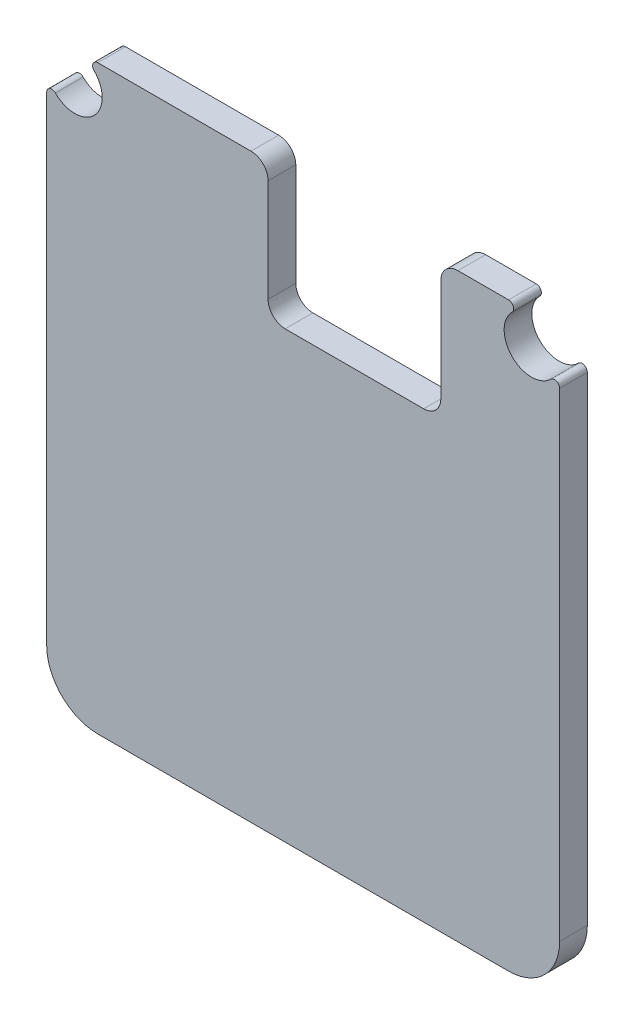
ISO-10303-21;
HEADER;
FILE_DESCRIPTION(('STEP AP214'),'2;1');
FILE_NAME('part.step','',(''),(''),'','','');
FILE_SCHEMA(('AUTOMOTIVE_DESIGN { 1 0 10303 214 1 1 1 1 }'));
ENDSEC;
DATA;
#1=APPLICATION_CONTEXT('core data for automotive mechanical design processes');
#2=APPLICATION_PROTOCOL_DEFINITION('international standard','automotive_design',2000,#1);
#3=PRODUCT_CONTEXT('',#1,'mechanical');
#4=PRODUCT('Part','Part','',(#3));
#5=PRODUCT_RELATED_PRODUCT_CATEGORY('part','',(#4));
#6=PRODUCT_DEFINITION_FORMATION('','',#4);
#7=PRODUCT_DEFINITION_CONTEXT('part definition',#1,'design');
#8=PRODUCT_DEFINITION('design','',#6,#7);
#9=PRODUCT_DEFINITION_SHAPE('','',#8);
#10=(LENGTH_UNIT() NAMED_UNIT(*) SI_UNIT(.MILLI.,.METRE.));
#11=(NAMED_UNIT(*) PLANE_ANGLE_UNIT() SI_UNIT($,.RADIAN.));
#12=(NAMED_UNIT(*) SI_UNIT($,.STERADIAN.) SOLID_ANGLE_UNIT());
#13=UNCERTAINTY_MEASURE_WITH_UNIT(LENGTH_MEASURE(1.E-05),#10,'distance_accuracy_value','');
#14=(GEOMETRIC_REPRESENTATION_CONTEXT(3) GLOBAL_UNCERTAINTY_ASSIGNED_CONTEXT((#13)) GLOBAL_UNIT_ASSIGNED_CONTEXT((#10,
#11,#12)) REPRESENTATION_CONTEXT('',''));
#15=CARTESIAN_POINT('',(0.,0.,0.));
#16=DIRECTION('',(0.,0.,1.));
#17=DIRECTION('',(1.,0.,0.));
#18=AXIS2_PLACEMENT_3D('',#15,#16,#17);
#19=CARTESIAN_POINT('',(13.,29.,1.6194));
#20=DIRECTION('',(0.,0.,-1.));
#21=DIRECTION('',(-1.,0.,0.));
#22=AXIS2_PLACEMENT_3D('',#19,#20,#21);
#23=CYLINDRICAL_SURFACE('',#22,3.);
#24=CARTESIAN_POINT('',(13.,29.,0.));
#25=DIRECTION('',(0.,0.,1.));
#26=DIRECTION('',(-1.,0.,0.));
#27=AXIS2_PLACEMENT_3D('',#24,#25,#26);
#28=CIRCLE('',#27,3.);
#29=CARTESIAN_POINT('',(10.,29.,0.));
#30=VERTEX_POINT('',#29);
#31=CARTESIAN_POINT('',(13.,26.,0.));
#32=VERTEX_POINT('',#31);
#33=EDGE_CURVE('E203',#30,#32,#28,.T.);
#34=ORIENTED_EDGE('',*,*,#33,.T.);
#35=DIRECTION('',(0.,0.,-1.));
#36=VECTOR('',#35,1.);
#37=CARTESIAN_POINT('',(13.,26.,1.6194));
#38=LINE('',#37,#36);
#39=CARTESIAN_POINT('',(13.,26.,1.6194));
#40=VERTEX_POINT('',#39);
#41=EDGE_CURVE('E11',#40,#32,#38,.T.);
#42=ORIENTED_EDGE('',*,*,#41,.F.);
#43=CARTESIAN_POINT('',(13.,29.,1.6194));
#44=DIRECTION('',(0.,0.,1.));
#45=DIRECTION('',(-1.,0.,0.));
#46=AXIS2_PLACEMENT_3D('',#43,#44,#45);
#47=CIRCLE('',#46,3.);
#48=CARTESIAN_POINT('',(10.,29.,1.6194));
#49=VERTEX_POINT('',#48);
#50=EDGE_CURVE('E241',#49,#40,#47,.T.);
#51=ORIENTED_EDGE('',*,*,#50,.F.);
#52=DIRECTION('',(0.,0.,-1.));
#53=VECTOR('',#52,1.);
#54=CARTESIAN_POINT('',(10.,29.,1.6194));
#55=LINE('',#54,#53);
#56=EDGE_CURVE('E199',#49,#30,#55,.T.);
#57=ORIENTED_EDGE('',*,*,#56,.T.);
#58=EDGE_LOOP('',(#34,#42,#51,#57));
#59=FACE_BOUND('',#58,.T.);
#60=ADVANCED_FACE('F35',(#59),#23,.T.);
#61=CARTESIAN_POINT('',(37.,26.,1.6194));
#62=DIRECTION('',(0.,1.,0.));
#63=DIRECTION('',(0.,0.,1.));
#64=AXIS2_PLACEMENT_3D('',#61,#62,#63);
#65=PLANE('',#64);
#66=DIRECTION('',(1.,0.,0.));
#67=VECTOR('',#66,1.);
#68=CARTESIAN_POINT('',(37.,26.,0.));
#69=LINE('',#68,#67);
#70=CARTESIAN_POINT('',(37.,26.,0.));
#71=VERTEX_POINT('',#70);
#72=EDGE_CURVE('E206',#32,#71,#69,.T.);
#73=ORIENTED_EDGE('',*,*,#72,.T.);
#74=DIRECTION('',(0.,0.,-1.));
#75=VECTOR('',#74,1.);
#76=CARTESIAN_POINT('',(37.,26.,1.6194));
#77=LINE('',#76,#75);
#78=CARTESIAN_POINT('',(37.,26.,1.6194));
#79=VERTEX_POINT('',#78);
#80=EDGE_CURVE('E43',#79,#71,#77,.T.);
#81=ORIENTED_EDGE('',*,*,#80,.F.);
#82=DIRECTION('',(1.,0.,0.));
#83=VECTOR('',#82,1.);
#84=CARTESIAN_POINT('',(37.,26.,1.6194));
#85=LINE('',#84,#83);
#86=EDGE_CURVE('E130',#40,#79,#85,.T.);
#87=ORIENTED_EDGE('',*,*,#86,.F.);
#88=ORIENTED_EDGE('',*,*,#41,.T.);
#89=EDGE_LOOP('',(#73,#81,#87,#88));
#90=FACE_BOUND('',#89,.T.);
#91=ADVANCED_FACE('F359',(#90),#65,.F.);
#92=CARTESIAN_POINT('',(37.0000100000167,28.9999899999833,1.6194));
#93=DIRECTION('',(0.,0.,-1.));
#94=DIRECTION('',(-1.,0.,0.));
#95=AXIS2_PLACEMENT_3D('',#92,#93,#94);
#96=CYLINDRICAL_SURFACE('',#95,2.99999);
#97=CARTESIAN_POINT('',(37.0000100000167,28.9999899999833,0.));
#98=DIRECTION('',(0.,0.,1.));
#99=DIRECTION('',(-1.,0.,0.));
#100=AXIS2_PLACEMENT_3D('',#97,#98,#99);
#101=CIRCLE('',#100,2.99999);
#102=CARTESIAN_POINT('',(40.,29.,0.));
#103=VERTEX_POINT('',#102);
#104=EDGE_CURVE('E208',#71,#103,#101,.T.);
#105=ORIENTED_EDGE('',*,*,#104,.T.);
#106=DIRECTION('',(0.,0.,-1.));
#107=VECTOR('',#106,1.);
#108=CARTESIAN_POINT('',(40.,29.,1.6194));
#109=LINE('',#108,#107);
#110=CARTESIAN_POINT('',(40.,29.,1.6194));
#111=VERTEX_POINT('',#110);
#112=EDGE_CURVE('E284',#111,#103,#109,.T.);
#113=ORIENTED_EDGE('',*,*,#112,.F.);
#114=CARTESIAN_POINT('',(37.0000100000167,28.9999899999833,1.6194));
#115=DIRECTION('',(0.,0.,1.));
#116=DIRECTION('',(-1.,0.,0.));
#117=AXIS2_PLACEMENT_3D('',#114,#115,#116);
#118=CIRCLE('',#117,2.99999);
#119=EDGE_CURVE('E292',#79,#111,#118,.T.);
#120=ORIENTED_EDGE('',*,*,#119,.F.);
#121=ORIENTED_EDGE('',*,*,#80,.T.);
#122=EDGE_LOOP('',(#105,#113,#120,#121));
#123=FACE_BOUND('',#122,.T.);
#124=ADVANCED_FACE('F290',(#123),#96,.T.);
#125=CARTESIAN_POINT('',(40.,57.01299,1.6194));
#126=DIRECTION('',(-1.,0.,0.));
#127=DIRECTION('',(0.,0.,1.));
#128=AXIS2_PLACEMENT_3D('',#125,#126,#127);
#129=PLANE('',#128);
#130=DIRECTION('',(0.,1.,0.));
#131=VECTOR('',#130,1.);
#132=CARTESIAN_POINT('',(40.,57.01299,0.));
#133=LINE('',#132,#131);
#134=CARTESIAN_POINT('',(40.,57.01299,0.));
#135=VERTEX_POINT('',#134);
#136=EDGE_CURVE('E210',#103,#135,#133,.T.);
#137=ORIENTED_EDGE('',*,*,#136,.T.);
#138=DIRECTION('',(0.,0.,-1.));
#139=VECTOR('',#138,1.);
#140=CARTESIAN_POINT('',(40.,57.01299,1.6194));
#141=LINE('',#140,#139);
#142=CARTESIAN_POINT('',(40.,57.01299,1.6194));
#143=VERTEX_POINT('',#142);
#144=EDGE_CURVE('E281',#143,#135,#141,.T.);
#145=ORIENTED_EDGE('',*,*,#144,.F.);
#146=DIRECTION('',(0.,1.,0.));
#147=VECTOR('',#146,1.);
#148=CARTESIAN_POINT('',(40.,57.01299,1.6194));
#149=LINE('',#148,#147);
#150=EDGE_CURVE('E310',#111,#143,#149,.T.);
#151=ORIENTED_EDGE('',*,*,#150,.F.);
#152=ORIENTED_EDGE('',*,*,#112,.T.);
#153=EDGE_LOOP('',(#137,#145,#151,#152));
#154=FACE_BOUND('',#153,.T.);
#155=ADVANCED_FACE('F301',(#154),#129,.F.);
#156=CARTESIAN_POINT('',(39.700000000423,57.0130059320103,1.6194));
#157=DIRECTION('',(0.,0.,-1.));
#158=DIRECTION('',(-1.,0.,0.));
#159=AXIS2_PLACEMENT_3D('',#156,#157,#158);
#160=CYLINDRICAL_SURFACE('',#159,0.300000000000002);
#161=CARTESIAN_POINT('',(39.700000000423,57.0130059320103,0.));
#162=DIRECTION('',(0.,0.,1.));
#163=DIRECTION('',(-1.,0.,0.));
#164=AXIS2_PLACEMENT_3D('',#161,#162,#163);
#165=CIRCLE('',#164,0.300000000000002);
#166=CARTESIAN_POINT('',(39.48786,57.22513,0.));
#167=VERTEX_POINT('',#166);
#168=EDGE_CURVE('E212',#135,#167,#165,.T.);
#169=ORIENTED_EDGE('',*,*,#168,.T.);
#170=DIRECTION('',(0.,0.,-1.));
#171=VECTOR('',#170,1.);
#172=CARTESIAN_POINT('',(39.48786,57.22513,1.6194));
#173=LINE('',#172,#171);
#174=CARTESIAN_POINT('',(39.48786,57.22513,1.6194));
#175=VERTEX_POINT('',#174);
#176=EDGE_CURVE('E278',#175,#167,#173,.T.);
#177=ORIENTED_EDGE('',*,*,#176,.F.);
#178=CARTESIAN_POINT('',(39.700000000423,57.0130059320103,1.6194));
#179=DIRECTION('',(0.,0.,1.));
#180=DIRECTION('',(-1.,0.,0.));
#181=AXIS2_PLACEMENT_3D('',#178,#179,#180);
#182=CIRCLE('',#181,0.300000000000002);
#183=EDGE_CURVE('E307',#143,#175,#182,.T.);
#184=ORIENTED_EDGE('',*,*,#183,.F.);
#185=ORIENTED_EDGE('',*,*,#144,.T.);
#186=EDGE_LOOP('',(#169,#177,#184,#185));
#187=FACE_BOUND('',#186,.T.);
#188=ADVANCED_FACE('F305',(#187),#160,.T.);
#189=CARTESIAN_POINT('',(38.35510324119,58.35511324119,1.6194));
#190=DIRECTION('',(0.,0.,-1.));
#191=DIRECTION('',(-1.,0.,0.));
#192=AXIS2_PLACEMENT_3D('',#189,#190,#191);
#193=CYLINDRICAL_SURFACE('',#192,1.6);
#194=CARTESIAN_POINT('',(38.35510324119,58.35511324119,0.));
#195=DIRECTION('',(0.,0.,-1.));
#196=DIRECTION('',(1.,0.,0.));
#197=AXIS2_PLACEMENT_3D('',#194,#195,#196);
#198=CIRCLE('',#197,1.6);
#199=CARTESIAN_POINT('',(37.22512,59.48787,0.));
#200=VERTEX_POINT('',#199);
#201=EDGE_CURVE('E214',#167,#200,#198,.T.);
#202=ORIENTED_EDGE('',*,*,#201,.T.);
#203=DIRECTION('',(0.,0.,-1.));
#204=VECTOR('',#203,1.);
#205=CARTESIAN_POINT('',(37.22512,59.48787,1.6194));
#206=LINE('',#205,#204);
#207=CARTESIAN_POINT('',(37.22512,59.48787,1.6194));
#208=VERTEX_POINT('',#207);
#209=EDGE_CURVE('E275',#208,#200,#206,.T.);
#210=ORIENTED_EDGE('',*,*,#209,.F.);
#211=CARTESIAN_POINT('',(38.35510324119,58.35511324119,1.6194));
#212=DIRECTION('',(0.,0.,-1.));
#213=DIRECTION('',(1.,0.,0.));
#214=AXIS2_PLACEMENT_3D('',#211,#212,#213);
#215=CIRCLE('',#214,1.6);
#216=EDGE_CURVE('E309',#175,#208,#215,.T.);
#217=ORIENTED_EDGE('',*,*,#216,.F.);
#218=ORIENTED_EDGE('',*,*,#176,.T.);
#219=EDGE_LOOP('',(#202,#210,#217,#218));
#220=FACE_BOUND('',#219,.T.);
#221=ADVANCED_FACE('F372',(#220),#193,.F.);
#222=CARTESIAN_POINT('',(37.0129859313352,59.7000000000276,1.6194));
#223=DIRECTION('',(0.,0.,-1.));
#224=DIRECTION('',(-1.,0.,0.));
#225=AXIS2_PLACEMENT_3D('',#222,#223,#224);
#226=CYLINDRICAL_SURFACE('',#225,0.300000000000002);
#227=CARTESIAN_POINT('',(37.0129859313352,59.7000000000276,0.));
#228=DIRECTION('',(0.,0.,1.));
#229=DIRECTION('',(-1.,0.,0.));
#230=AXIS2_PLACEMENT_3D('',#227,#228,#229);
#231=CIRCLE('',#230,0.300000000000002);
#232=CARTESIAN_POINT('',(37.01299,60.,0.));
#233=VERTEX_POINT('',#232);
#234=EDGE_CURVE('E216',#200,#233,#231,.T.);
#235=ORIENTED_EDGE('',*,*,#234,.T.);
#236=DIRECTION('',(0.,0.,-1.));
#237=VECTOR('',#236,1.);
#238=CARTESIAN_POINT('',(37.01299,60.,1.6194));
#239=LINE('',#238,#237);
#240=CARTESIAN_POINT('',(37.01299,60.,1.6194));
#241=VERTEX_POINT('',#240);
#242=EDGE_CURVE('E272',#241,#233,#239,.T.);
#243=ORIENTED_EDGE('',*,*,#242,.F.);
#244=CARTESIAN_POINT('',(37.0129859313352,59.7000000000276,1.6194));
#245=DIRECTION('',(0.,0.,1.));
#246=DIRECTION('',(-1.,0.,0.));
#247=AXIS2_PLACEMENT_3D('',#244,#245,#246);
#248=CIRCLE('',#247,0.300000000000002);
#249=EDGE_CURVE('E312',#208,#241,#248,.T.);
#250=ORIENTED_EDGE('',*,*,#249,.F.);
#251=ORIENTED_EDGE('',*,*,#209,.T.);
#252=EDGE_LOOP('',(#235,#243,#250,#251));
#253=FACE_BOUND('',#252,.T.);
#254=ADVANCED_FACE('F375',(#253),#226,.T.);
#255=CARTESIAN_POINT('',(34.05,60.,1.6194));
#256=DIRECTION('',(0.,-1.,0.));
#257=DIRECTION('',(0.,0.,-1.));
#258=AXIS2_PLACEMENT_3D('',#255,#256,#257);
#259=PLANE('',#258);
#260=DIRECTION('',(-1.,0.,0.));
#261=VECTOR('',#260,1.);
#262=CARTESIAN_POINT('',(34.05,60.,0.));
#263=LINE('',#262,#261);
#264=CARTESIAN_POINT('',(34.05,60.,0.));
#265=VERTEX_POINT('',#264);
#266=EDGE_CURVE('E218',#233,#265,#263,.T.);
#267=ORIENTED_EDGE('',*,*,#266,.T.);
#268=DIRECTION('',(0.,0.,-1.));
#269=VECTOR('',#268,1.);
#270=CARTESIAN_POINT('',(34.05,60.,1.6194));
#271=LINE('',#270,#269);
#272=CARTESIAN_POINT('',(34.05,60.,1.6194));
#273=VERTEX_POINT('',#272);
#274=EDGE_CURVE('E269',#273,#265,#271,.T.);
#275=ORIENTED_EDGE('',*,*,#274,.F.);
#276=DIRECTION('',(-1.,0.,0.));
#277=VECTOR('',#276,1.);
#278=CARTESIAN_POINT('',(34.05,60.,1.6194));
#279=LINE('',#278,#277);
#280=EDGE_CURVE('E318',#241,#273,#279,.T.);
#281=ORIENTED_EDGE('',*,*,#280,.F.);
#282=ORIENTED_EDGE('',*,*,#242,.T.);
#283=EDGE_LOOP('',(#267,#275,#281,#282));
#284=FACE_BOUND('',#283,.T.);
#285=ADVANCED_FACE('F379',(#284),#259,.F.);
#286=CARTESIAN_POINT('',(34.05,59.,1.6194));
#287=DIRECTION('',(0.,0.,-1.));
#288=DIRECTION('',(-1.,0.,0.));
#289=AXIS2_PLACEMENT_3D('',#286,#287,#288);
#290=CYLINDRICAL_SURFACE('',#289,1.);
#291=CARTESIAN_POINT('',(34.05,59.,0.));
#292=DIRECTION('',(0.,0.,1.));
#293=DIRECTION('',(-1.,0.,0.));
#294=AXIS2_PLACEMENT_3D('',#291,#292,#293);
#295=CIRCLE('',#294,1.);
#296=CARTESIAN_POINT('',(33.05,59.,0.));
#297=VERTEX_POINT('',#296);
#298=EDGE_CURVE('E220',#265,#297,#295,.T.);
#299=ORIENTED_EDGE('',*,*,#298,.T.);
#300=DIRECTION('',(0.,0.,-1.));
#301=VECTOR('',#300,1.);
#302=CARTESIAN_POINT('',(33.05,59.,1.6194));
#303=LINE('',#302,#301);
#304=CARTESIAN_POINT('',(33.05,59.,1.6194));
#305=VERTEX_POINT('',#304);
#306=EDGE_CURVE('E266',#305,#297,#303,.T.);
#307=ORIENTED_EDGE('',*,*,#306,.F.);
#308=CARTESIAN_POINT('',(34.05,59.,1.6194));
#309=DIRECTION('',(0.,0.,1.));
#310=DIRECTION('',(-1.,0.,0.));
#311=AXIS2_PLACEMENT_3D('',#308,#309,#310);
#312=CIRCLE('',#311,1.);
#313=EDGE_CURVE('E320',#273,#305,#312,.T.);
#314=ORIENTED_EDGE('',*,*,#313,.F.);
#315=ORIENTED_EDGE('',*,*,#274,.T.);
#316=EDGE_LOOP('',(#299,#307,#314,#315));
#317=FACE_BOUND('',#316,.T.);
#318=ADVANCED_FACE('F383',(#317),#290,.T.);
#319=CARTESIAN_POINT('',(33.05,53.,1.6194));
#320=DIRECTION('',(1.,0.,0.));
#321=DIRECTION('',(0.,0.,-1.));
#322=AXIS2_PLACEMENT_3D('',#319,#320,#321);
#323=PLANE('',#322);
#324=DIRECTION('',(0.,-1.,0.));
#325=VECTOR('',#324,1.);
#326=CARTESIAN_POINT('',(33.05,53.,0.));
#327=LINE('',#326,#325);
#328=CARTESIAN_POINT('',(33.05,53.,0.));
#329=VERTEX_POINT('',#328);
#330=EDGE_CURVE('E222',#297,#329,#327,.T.);
#331=ORIENTED_EDGE('',*,*,#330,.T.);
#332=DIRECTION('',(0.,0.,-1.));
#333=VECTOR('',#332,1.);
#334=CARTESIAN_POINT('',(33.05,53.,1.6194));
#335=LINE('',#334,#333);
#336=CARTESIAN_POINT('',(33.05,53.,1.6194));
#337=VERTEX_POINT('',#336);
#338=EDGE_CURVE('E263',#337,#329,#335,.T.);
#339=ORIENTED_EDGE('',*,*,#338,.F.);
#340=DIRECTION('',(0.,-1.,0.));
#341=VECTOR('',#340,1.);
#342=CARTESIAN_POINT('',(33.05,53.,1.6194));
#343=LINE('',#342,#341);
#344=EDGE_CURVE('E322',#305,#337,#343,.T.);
#345=ORIENTED_EDGE('',*,*,#344,.F.);
#346=ORIENTED_EDGE('',*,*,#306,.T.);
#347=EDGE_LOOP('',(#331,#339,#345,#346));
#348=FACE_BOUND('',#347,.T.);
#349=ADVANCED_FACE('F387',(#348),#323,.F.);
#350=CARTESIAN_POINT('',(32.05,53.,1.6194));
#351=DIRECTION('',(0.,0.,-1.));
#352=DIRECTION('',(-1.,0.,0.));
#353=AXIS2_PLACEMENT_3D('',#350,#351,#352);
#354=CYLINDRICAL_SURFACE('',#353,1.);
#355=CARTESIAN_POINT('',(32.05,53.,0.));
#356=DIRECTION('',(0.,0.,-1.));
#357=DIRECTION('',(1.,0.,0.));
#358=AXIS2_PLACEMENT_3D('',#355,#356,#357);
#359=CIRCLE('',#358,1.);
#360=CARTESIAN_POINT('',(32.05,52.,0.));
#361=VERTEX_POINT('',#360);
#362=EDGE_CURVE('E224',#329,#361,#359,.T.);
#363=ORIENTED_EDGE('',*,*,#362,.T.);
#364=DIRECTION('',(0.,0.,-1.));
#365=VECTOR('',#364,1.);
#366=CARTESIAN_POINT('',(32.05,52.,1.6194));
#367=LINE('',#366,#365);
#368=CARTESIAN_POINT('',(32.05,52.,1.6194));
#369=VERTEX_POINT('',#368);
#370=EDGE_CURVE('E260',#369,#361,#367,.T.);
#371=ORIENTED_EDGE('',*,*,#370,.F.);
#372=CARTESIAN_POINT('',(32.05,53.,1.6194));
#373=DIRECTION('',(0.,0.,-1.));
#374=DIRECTION('',(1.,0.,0.));
#375=AXIS2_PLACEMENT_3D('',#372,#373,#374);
#376=CIRCLE('',#375,1.);
#377=EDGE_CURVE('E324',#337,#369,#376,.T.);
#378=ORIENTED_EDGE('',*,*,#377,.F.);
#379=ORIENTED_EDGE('',*,*,#338,.T.);
#380=EDGE_LOOP('',(#363,#371,#378,#379));
#381=FACE_BOUND('',#380,.T.);
#382=ADVANCED_FACE('F391',(#381),#354,.F.);
#383=CARTESIAN_POINT('',(23.95,52.,1.6194));
#384=DIRECTION('',(0.,-1.,0.));
#385=DIRECTION('',(0.,0.,-1.));
#386=AXIS2_PLACEMENT_3D('',#383,#384,#385);
#387=PLANE('',#386);
#388=DIRECTION('',(-1.,0.,0.));
#389=VECTOR('',#388,1.);
#390=CARTESIAN_POINT('',(23.95,52.,0.));
#391=LINE('',#390,#389);
#392=CARTESIAN_POINT('',(23.95,52.,0.));
#393=VERTEX_POINT('',#392);
#394=EDGE_CURVE('E226',#361,#393,#391,.T.);
#395=ORIENTED_EDGE('',*,*,#394,.T.);
#396=DIRECTION('',(0.,0.,-1.));
#397=VECTOR('',#396,1.);
#398=CARTESIAN_POINT('',(23.95,52.,1.6194));
#399=LINE('',#398,#397);
#400=CARTESIAN_POINT('',(23.95,52.,1.6194));
#401=VERTEX_POINT('',#400);
#402=EDGE_CURVE('E257',#401,#393,#399,.T.);
#403=ORIENTED_EDGE('',*,*,#402,.F.);
#404=DIRECTION('',(-1.,0.,0.));
#405=VECTOR('',#404,1.);
#406=CARTESIAN_POINT('',(23.95,52.,1.6194));
#407=LINE('',#406,#405);
#408=EDGE_CURVE('E326',#369,#401,#407,.T.);
#409=ORIENTED_EDGE('',*,*,#408,.F.);
#410=ORIENTED_EDGE('',*,*,#370,.T.);
#411=EDGE_LOOP('',(#395,#403,#409,#410));
#412=FACE_BOUND('',#411,.T.);
#413=ADVANCED_FACE('F395',(#412),#387,.F.);
#414=CARTESIAN_POINT('',(23.95,53.,1.6194));
#415=DIRECTION('',(0.,0.,-1.));
#416=DIRECTION('',(-1.,0.,0.));
#417=AXIS2_PLACEMENT_3D('',#414,#415,#416);
#418=CYLINDRICAL_SURFACE('',#417,1.);
#419=CARTESIAN_POINT('',(23.95,53.,0.));
#420=DIRECTION('',(0.,0.,-1.));
#421=DIRECTION('',(1.,0.,0.));
#422=AXIS2_PLACEMENT_3D('',#419,#420,#421);
#423=CIRCLE('',#422,1.);
#424=CARTESIAN_POINT('',(22.95,53.,0.));
#425=VERTEX_POINT('',#424);
#426=EDGE_CURVE('E228',#393,#425,#423,.T.);
#427=ORIENTED_EDGE('',*,*,#426,.T.);
#428=DIRECTION('',(0.,0.,-1.));
#429=VECTOR('',#428,1.);
#430=CARTESIAN_POINT('',(22.95,53.,1.6194));
#431=LINE('',#430,#429);
#432=CARTESIAN_POINT('',(22.95,53.,1.6194));
#433=VERTEX_POINT('',#432);
#434=EDGE_CURVE('E254',#433,#425,#431,.T.);
#435=ORIENTED_EDGE('',*,*,#434,.F.);
#436=CARTESIAN_POINT('',(23.95,53.,1.6194));
#437=DIRECTION('',(0.,0.,-1.));
#438=DIRECTION('',(1.,0.,0.));
#439=AXIS2_PLACEMENT_3D('',#436,#437,#438);
#440=CIRCLE('',#439,1.);
#441=EDGE_CURVE('E328',#401,#433,#440,.T.);
#442=ORIENTED_EDGE('',*,*,#441,.F.);
#443=ORIENTED_EDGE('',*,*,#402,.T.);
#444=EDGE_LOOP('',(#427,#435,#442,#443));
#445=FACE_BOUND('',#444,.T.);
#446=ADVANCED_FACE('F399',(#445),#418,.F.);
#447=CARTESIAN_POINT('',(22.95,59.,1.6194));
#448=DIRECTION('',(-1.,0.,0.));
#449=DIRECTION('',(0.,0.,1.));
#450=AXIS2_PLACEMENT_3D('',#447,#448,#449);
#451=PLANE('',#450);
#452=DIRECTION('',(0.,1.,0.));
#453=VECTOR('',#452,1.);
#454=CARTESIAN_POINT('',(22.95,59.,0.));
#455=LINE('',#454,#453);
#456=CARTESIAN_POINT('',(22.95,59.,0.));
#457=VERTEX_POINT('',#456);
#458=EDGE_CURVE('E230',#425,#457,#455,.T.);
#459=ORIENTED_EDGE('',*,*,#458,.T.);
#460=DIRECTION('',(0.,0.,-1.));
#461=VECTOR('',#460,1.);
#462=CARTESIAN_POINT('',(22.95,59.,1.6194));
#463=LINE('',#462,#461);
#464=CARTESIAN_POINT('',(22.95,59.,1.6194));
#465=VERTEX_POINT('',#464);
#466=EDGE_CURVE('E251',#465,#457,#463,.T.);
#467=ORIENTED_EDGE('',*,*,#466,.F.);
#468=DIRECTION('',(0.,1.,0.));
#469=VECTOR('',#468,1.);
#470=CARTESIAN_POINT('',(22.95,59.,1.6194));
#471=LINE('',#470,#469);
#472=EDGE_CURVE('E330',#433,#465,#471,.T.);
#473=ORIENTED_EDGE('',*,*,#472,.F.);
#474=ORIENTED_EDGE('',*,*,#434,.T.);
#475=EDGE_LOOP('',(#459,#467,#473,#474));
#476=FACE_BOUND('',#475,.T.);
#477=ADVANCED_FACE('F403',(#476),#451,.F.);
#478=CARTESIAN_POINT('',(21.95,59.,1.6194));
#479=DIRECTION('',(0.,0.,-1.));
#480=DIRECTION('',(-1.,0.,0.));
#481=AXIS2_PLACEMENT_3D('',#478,#479,#480);
#482=CYLINDRICAL_SURFACE('',#481,1.);
#483=CARTESIAN_POINT('',(21.95,59.,0.));
#484=DIRECTION('',(0.,0.,1.));
#485=DIRECTION('',(-1.,0.,0.));
#486=AXIS2_PLACEMENT_3D('',#483,#484,#485);
#487=CIRCLE('',#486,1.);
#488=CARTESIAN_POINT('',(21.95,60.,0.));
#489=VERTEX_POINT('',#488);
#490=EDGE_CURVE('E232',#457,#489,#487,.T.);
#491=ORIENTED_EDGE('',*,*,#490,.T.);
#492=DIRECTION('',(0.,0.,-1.));
#493=VECTOR('',#492,1.);
#494=CARTESIAN_POINT('',(21.95,60.,1.6194));
#495=LINE('',#494,#493);
#496=CARTESIAN_POINT('',(21.95,60.,1.6194));
#497=VERTEX_POINT('',#496);
#498=EDGE_CURVE('E248',#497,#489,#495,.T.);
#499=ORIENTED_EDGE('',*,*,#498,.F.);
#500=CARTESIAN_POINT('',(21.95,59.,1.6194));
#501=DIRECTION('',(0.,0.,1.));
#502=DIRECTION('',(-1.,0.,0.));
#503=AXIS2_PLACEMENT_3D('',#500,#501,#502);
#504=CIRCLE('',#503,1.);
#505=EDGE_CURVE('E332',#465,#497,#504,.T.);
#506=ORIENTED_EDGE('',*,*,#505,.F.);
#507=ORIENTED_EDGE('',*,*,#466,.T.);
#508=EDGE_LOOP('',(#491,#499,#506,#507));
#509=FACE_BOUND('',#508,.T.);
#510=ADVANCED_FACE('F407',(#509),#482,.T.);
#511=CARTESIAN_POINT('',(12.987,60.,1.6194));
#512=DIRECTION('',(0.,-1.,0.));
#513=DIRECTION('',(0.,0.,-1.));
#514=AXIS2_PLACEMENT_3D('',#511,#512,#513);
#515=PLANE('',#514);
#516=DIRECTION('',(-1.,0.,0.));
#517=VECTOR('',#516,1.);
#518=CARTESIAN_POINT('',(12.987,60.,0.));
#519=LINE('',#518,#517);
#520=CARTESIAN_POINT('',(12.987,60.,0.));
#521=VERTEX_POINT('',#520);
#522=EDGE_CURVE('E234',#489,#521,#519,.T.);
#523=ORIENTED_EDGE('',*,*,#522,.T.);
#524=DIRECTION('',(0.,0.,-1.));
#525=VECTOR('',#524,1.);
#526=CARTESIAN_POINT('',(12.987,60.,1.6194));
#527=LINE('',#526,#525);
#528=CARTESIAN_POINT('',(12.987,60.,1.6194));
#529=VERTEX_POINT('',#528);
#530=EDGE_CURVE('E245',#529,#521,#527,.T.);
#531=ORIENTED_EDGE('',*,*,#530,.F.);
#532=DIRECTION('',(-1.,0.,0.));
#533=VECTOR('',#532,1.);
#534=CARTESIAN_POINT('',(12.987,60.,1.6194));
#535=LINE('',#534,#533);
#536=EDGE_CURVE('E334',#497,#529,#535,.T.);
#537=ORIENTED_EDGE('',*,*,#536,.F.);
#538=ORIENTED_EDGE('',*,*,#498,.T.);
#539=EDGE_LOOP('',(#523,#531,#537,#538));
#540=FACE_BOUND('',#539,.T.);
#541=ADVANCED_FACE('F340',(#540),#515,.F.);
#542=CARTESIAN_POINT('',(12.9869940683542,59.7000000000586,1.6194));
#543=DIRECTION('',(0.,0.,-1.));
#544=DIRECTION('',(-1.,0.,0.));
#545=AXIS2_PLACEMENT_3D('',#542,#543,#544);
#546=CYLINDRICAL_SURFACE('',#545,0.299999999999999);
#547=CARTESIAN_POINT('',(12.9869940683542,59.7000000000586,0.));
#548=DIRECTION('',(0.,0.,1.));
#549=DIRECTION('',(-1.,0.,0.));
#550=AXIS2_PLACEMENT_3D('',#547,#548,#549);
#551=CIRCLE('',#550,0.299999999999999);
#552=CARTESIAN_POINT('',(12.77487,59.48786,0.));
#553=VERTEX_POINT('',#552);
#554=EDGE_CURVE('E236',#521,#553,#551,.T.);
#555=ORIENTED_EDGE('',*,*,#554,.T.);
#556=DIRECTION('',(0.,0.,-1.));
#557=VECTOR('',#556,1.);
#558=CARTESIAN_POINT('',(12.77487,59.48786,1.6194));
#559=LINE('',#558,#557);
#560=CARTESIAN_POINT('',(12.77487,59.48786,1.6194));
#561=VERTEX_POINT('',#560);
#562=EDGE_CURVE('E194',#561,#553,#559,.T.);
#563=ORIENTED_EDGE('',*,*,#562,.F.);
#564=CARTESIAN_POINT('',(12.9869940683542,59.7000000000586,1.6194));
#565=DIRECTION('',(0.,0.,1.));
#566=DIRECTION('',(-1.,0.,0.));
#567=AXIS2_PLACEMENT_3D('',#564,#565,#566);
#568=CIRCLE('',#567,0.299999999999999);
#569=EDGE_CURVE('E185',#529,#561,#568,.T.);
#570=ORIENTED_EDGE('',*,*,#569,.F.);
#571=ORIENTED_EDGE('',*,*,#530,.T.);
#572=EDGE_LOOP('',(#555,#563,#570,#571));
#573=FACE_BOUND('',#572,.T.);
#574=ADVANCED_FACE('F344',(#573),#546,.T.);
#575=CARTESIAN_POINT('',(11.6462531625457,58.3537418252868,1.6194));
#576=DIRECTION('',(0.,0.,-1.));
#577=DIRECTION('',(-1.,0.,0.));
#578=AXIS2_PLACEMENT_3D('',#575,#576,#577);
#579=CYLINDRICAL_SURFACE('',#578,1.6);
#580=CARTESIAN_POINT('',(11.6462531625457,58.3537418252868,0.));
#581=DIRECTION('',(0.,0.,-1.));
#582=DIRECTION('',(1.,0.,0.));
#583=AXIS2_PLACEMENT_3D('',#580,#581,#582);
#584=CIRCLE('',#583,1.6);
#585=CARTESIAN_POINT('',(10.51213,57.22513,0.));
#586=VERTEX_POINT('',#585);
#587=EDGE_CURVE('E193',#553,#586,#584,.T.);
#588=ORIENTED_EDGE('',*,*,#587,.T.);
#589=DIRECTION('',(0.,0.,-1.));
#590=VECTOR('',#589,1.);
#591=CARTESIAN_POINT('',(10.51213,57.22513,1.6194));
#592=LINE('',#591,#590);
#593=CARTESIAN_POINT('',(10.51213,57.22513,1.6194));
#594=VERTEX_POINT('',#593);
#595=EDGE_CURVE('E190',#594,#586,#592,.T.);
#596=ORIENTED_EDGE('',*,*,#595,.F.);
#597=CARTESIAN_POINT('',(11.6462531625457,58.3537418252868,1.6194));
#598=DIRECTION('',(0.,0.,-1.));
#599=DIRECTION('',(1.,0.,0.));
#600=AXIS2_PLACEMENT_3D('',#597,#598,#599);
#601=CIRCLE('',#600,1.6);
#602=EDGE_CURVE('E179',#561,#594,#601,.T.);
#603=ORIENTED_EDGE('',*,*,#602,.F.);
#604=ORIENTED_EDGE('',*,*,#562,.T.);
#605=EDGE_LOOP('',(#588,#596,#603,#604));
#606=FACE_BOUND('',#605,.T.);
#607=ADVANCED_FACE('F191',(#606),#579,.F.);
#608=CARTESIAN_POINT('',(10.2999999999414,57.0129959313662,1.6194));
#609=DIRECTION('',(0.,0.,-1.));
#610=DIRECTION('',(-1.,0.,0.));
#611=AXIS2_PLACEMENT_3D('',#608,#609,#610);
#612=CYLINDRICAL_SURFACE('',#611,0.300000000000002);
#613=CARTESIAN_POINT('',(10.2999999999414,57.0129959313662,0.));
#614=DIRECTION('',(0.,0.,1.));
#615=DIRECTION('',(-1.,0.,0.));
#616=AXIS2_PLACEMENT_3D('',#613,#614,#615);
#617=CIRCLE('',#616,0.300000000000002);
#618=CARTESIAN_POINT('',(10.,57.01299,0.));
#619=VERTEX_POINT('',#618);
#620=EDGE_CURVE('E116',#586,#619,#617,.T.);
#621=ORIENTED_EDGE('',*,*,#620,.T.);
#622=DIRECTION('',(0.,0.,-1.));
#623=VECTOR('',#622,1.);
#624=CARTESIAN_POINT('',(10.,57.01299,1.6194));
#625=LINE('',#624,#623);
#626=CARTESIAN_POINT('',(10.,57.01299,1.6194));
#627=VERTEX_POINT('',#626);
#628=EDGE_CURVE('E195',#627,#619,#625,.T.);
#629=ORIENTED_EDGE('',*,*,#628,.F.);
#630=CARTESIAN_POINT('',(10.2999999999414,57.0129959313662,1.6194));
#631=DIRECTION('',(0.,0.,1.));
#632=DIRECTION('',(-1.,0.,0.));
#633=AXIS2_PLACEMENT_3D('',#630,#631,#632);
#634=CIRCLE('',#633,0.300000000000002);
#635=EDGE_CURVE('E183',#594,#627,#634,.T.);
#636=ORIENTED_EDGE('',*,*,#635,.F.);
#637=ORIENTED_EDGE('',*,*,#595,.T.);
#638=EDGE_LOOP('',(#621,#629,#636,#637));
#639=FACE_BOUND('',#638,.T.);
#640=ADVANCED_FACE('F197',(#639),#612,.T.);
#641=CARTESIAN_POINT('',(10.,29.,1.6194));
#642=DIRECTION('',(1.,0.,0.));
#643=DIRECTION('',(0.,0.,-1.));
#644=AXIS2_PLACEMENT_3D('',#641,#642,#643);
#645=PLANE('',#644);
#646=DIRECTION('',(0.,-1.,0.));
#647=VECTOR('',#646,1.);
#648=CARTESIAN_POINT('',(10.,29.,0.));
#649=LINE('',#648,#647);
#650=EDGE_CURVE('E122',#619,#30,#649,.T.);
#651=ORIENTED_EDGE('',*,*,#650,.T.);
#652=ORIENTED_EDGE('',*,*,#56,.F.);
#653=DIRECTION('',(0.,-1.,0.));
#654=VECTOR('',#653,1.);
#655=CARTESIAN_POINT('',(10.,29.,1.6194));
#656=LINE('',#655,#654);
#657=EDGE_CURVE('E51',#627,#49,#656,.T.);
#658=ORIENTED_EDGE('',*,*,#657,.F.);
#659=ORIENTED_EDGE('',*,*,#628,.T.);
#660=EDGE_LOOP('',(#651,#652,#658,#659));
#661=FACE_BOUND('',#660,.T.);
#662=ADVANCED_FACE('F348',(#661),#645,.F.);
#663=CARTESIAN_POINT('',(13.,29.,1.6194));
#664=DIRECTION('',(0.,0.,-1.));
#665=DIRECTION('',(-1.,0.,0.));
#666=AXIS2_PLACEMENT_3D('',#663,#664,#665);
#667=PLANE('',#666);
#668=ORIENTED_EDGE('',*,*,#50,.T.);
#669=ORIENTED_EDGE('',*,*,#86,.T.);
#670=ORIENTED_EDGE('',*,*,#119,.T.);
#671=ORIENTED_EDGE('',*,*,#150,.T.);
#672=ORIENTED_EDGE('',*,*,#183,.T.);
#673=ORIENTED_EDGE('',*,*,#216,.T.);
#674=ORIENTED_EDGE('',*,*,#249,.T.);
#675=ORIENTED_EDGE('',*,*,#280,.T.);
#676=ORIENTED_EDGE('',*,*,#313,.T.);
#677=ORIENTED_EDGE('',*,*,#344,.T.);
#678=ORIENTED_EDGE('',*,*,#377,.T.);
#679=ORIENTED_EDGE('',*,*,#408,.T.);
#680=ORIENTED_EDGE('',*,*,#441,.T.);
#681=ORIENTED_EDGE('',*,*,#472,.T.);
#682=ORIENTED_EDGE('',*,*,#505,.T.);
#683=ORIENTED_EDGE('',*,*,#536,.T.);
#684=ORIENTED_EDGE('',*,*,#569,.T.);
#685=ORIENTED_EDGE('',*,*,#602,.T.);
#686=ORIENTED_EDGE('',*,*,#635,.T.);
#687=ORIENTED_EDGE('',*,*,#657,.T.);
#688=EDGE_LOOP('',(#668,#669,#670,#671,#672,#673,#674,#675,#676,#677,#678,#679,#680,#681,#682,
#683,#684,#685,#686,#687));
#689=FACE_BOUND('',#688,.T.);
#690=ADVANCED_FACE('F181',(#689),#667,.F.);
#691=CARTESIAN_POINT('',(13.,29.,0.));
#692=DIRECTION('',(0.,0.,-1.));
#693=DIRECTION('',(-1.,0.,0.));
#694=AXIS2_PLACEMENT_3D('',#691,#692,#693);
#695=PLANE('',#694);
#696=ORIENTED_EDGE('',*,*,#33,.F.);
#697=ORIENTED_EDGE('',*,*,#650,.F.);
#698=ORIENTED_EDGE('',*,*,#620,.F.);
#699=ORIENTED_EDGE('',*,*,#587,.F.);
#700=ORIENTED_EDGE('',*,*,#554,.F.);
#701=ORIENTED_EDGE('',*,*,#522,.F.);
#702=ORIENTED_EDGE('',*,*,#490,.F.);
#703=ORIENTED_EDGE('',*,*,#458,.F.);
#704=ORIENTED_EDGE('',*,*,#426,.F.);
#705=ORIENTED_EDGE('',*,*,#394,.F.);
#706=ORIENTED_EDGE('',*,*,#362,.F.);
#707=ORIENTED_EDGE('',*,*,#330,.F.);
#708=ORIENTED_EDGE('',*,*,#298,.F.);
#709=ORIENTED_EDGE('',*,*,#266,.F.);
#710=ORIENTED_EDGE('',*,*,#234,.F.);
#711=ORIENTED_EDGE('',*,*,#201,.F.);
#712=ORIENTED_EDGE('',*,*,#168,.F.);
#713=ORIENTED_EDGE('',*,*,#136,.F.);
#714=ORIENTED_EDGE('',*,*,#104,.F.);
#715=ORIENTED_EDGE('',*,*,#72,.F.);
#716=EDGE_LOOP('',(#696,#697,#698,#699,#700,#701,#702,#703,#704,#705,#706,#707,#708,#709,#710,
#711,#712,#713,#714,#715));
#717=FACE_BOUND('',#716,.T.);
#718=ADVANCED_FACE('F296',(#717),#695,.T.);
#719=CLOSED_SHELL('',(#60,#91,#124,#155,#188,#221,#254,#285,#318,#349,#382,#413,#446,#477,#510,
#541,#574,#607,#640,#662,#690,#718));
#720=MANIFOLD_SOLID_BREP('B2',#719);
#721=ADVANCED_BREP_SHAPE_REPRESENTATION('',(#18,#720),#14);
#722=SHAPE_DEFINITION_REPRESENTATION(#9,#721);
ENDSEC;
END-ISO-10303-21;
